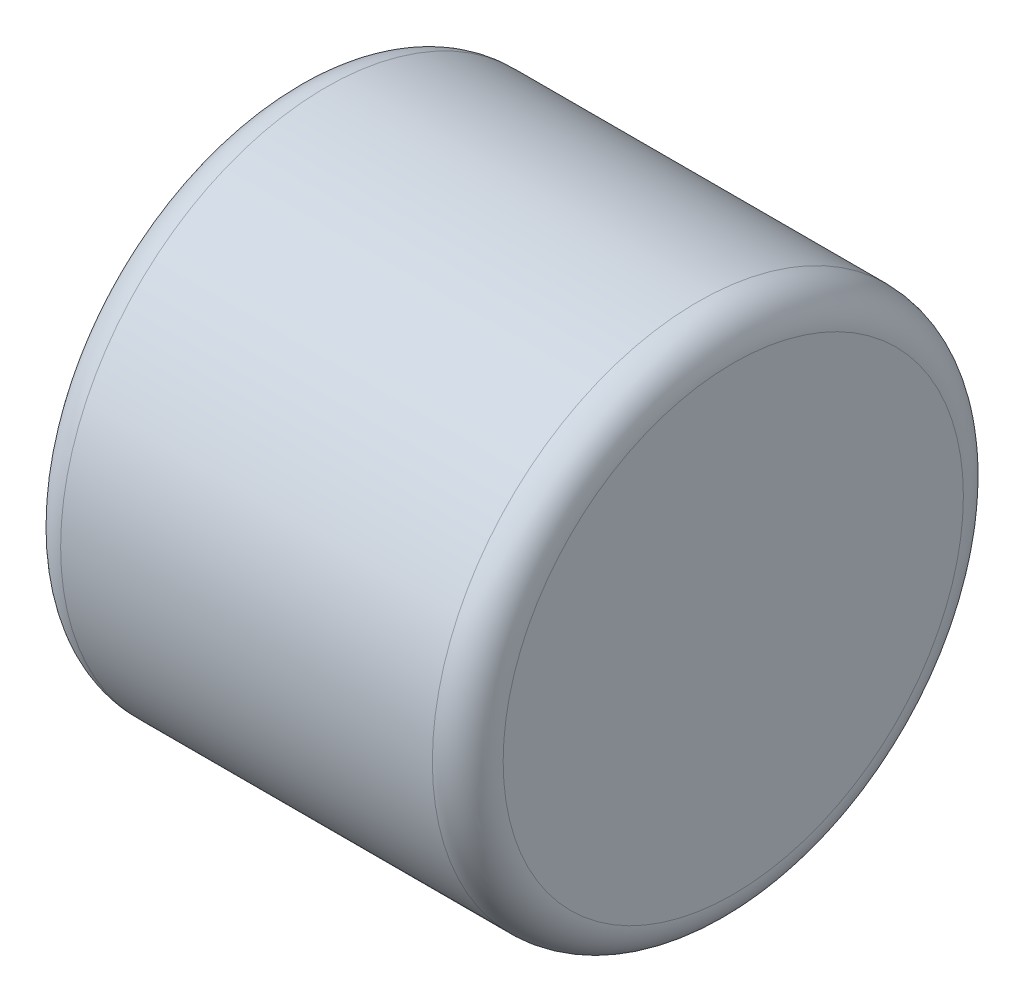
ISO-10303-21;
HEADER;
FILE_DESCRIPTION(('STEP AP214'),'2;1');
FILE_NAME('part.step','',(''),(''),'','','');
FILE_SCHEMA(('AUTOMOTIVE_DESIGN { 1 0 10303 214 1 1 1 1 }'));
ENDSEC;
DATA;
#1=APPLICATION_CONTEXT('core data for automotive mechanical design processes');
#2=APPLICATION_PROTOCOL_DEFINITION('international standard','automotive_design',2000,#1);
#3=PRODUCT_CONTEXT('',#1,'mechanical');
#4=PRODUCT('Part','Part','',(#3));
#5=PRODUCT_RELATED_PRODUCT_CATEGORY('part','',(#4));
#6=PRODUCT_DEFINITION_FORMATION('','',#4);
#7=PRODUCT_DEFINITION_CONTEXT('part definition',#1,'design');
#8=PRODUCT_DEFINITION('design','',#6,#7);
#9=PRODUCT_DEFINITION_SHAPE('','',#8);
#10=(LENGTH_UNIT() NAMED_UNIT(*) SI_UNIT(.MILLI.,.METRE.));
#11=(NAMED_UNIT(*) PLANE_ANGLE_UNIT() SI_UNIT($,.RADIAN.));
#12=(NAMED_UNIT(*) SI_UNIT($,.STERADIAN.) SOLID_ANGLE_UNIT());
#13=UNCERTAINTY_MEASURE_WITH_UNIT(LENGTH_MEASURE(1.E-05),#10,'distance_accuracy_value','');
#14=(GEOMETRIC_REPRESENTATION_CONTEXT(3) GLOBAL_UNCERTAINTY_ASSIGNED_CONTEXT((#13)) GLOBAL_UNIT_ASSIGNED_CONTEXT((#10,
#11,#12)) REPRESENTATION_CONTEXT('',''));
#15=CARTESIAN_POINT('',(0.,0.,0.));
#16=DIRECTION('',(0.,0.,1.));
#17=DIRECTION('',(1.,0.,0.));
#18=AXIS2_PLACEMENT_3D('',#15,#16,#17);
#19=CARTESIAN_POINT('',(2.5,0.,0.));
#20=DIRECTION('',(-1.,0.,0.));
#21=DIRECTION('',(0.,0.,1.));
#22=AXIS2_PLACEMENT_3D('',#19,#20,#21);
#23=PLANE('',#22);
#24=CARTESIAN_POINT('',(2.5,0.,0.));
#25=DIRECTION('',(-1.,0.,0.));
#26=DIRECTION('',(0.,0.,1.));
#27=AXIS2_PLACEMENT_3D('',#24,#25,#26);
#28=CIRCLE('',#27,1.3);
#29=CARTESIAN_POINT('',(2.5,0.,1.3));
#30=VERTEX_POINT('',#29);
#31=CARTESIAN_POINT('',(2.5,0.,-1.3));
#32=VERTEX_POINT('',#31);
#33=EDGE_CURVE('E46',#30,#32,#28,.T.);
#34=ORIENTED_EDGE('',*,*,#33,.F.);
#35=CARTESIAN_POINT('',(2.5,0.,0.));
#36=DIRECTION('',(-1.,0.,0.));
#37=DIRECTION('',(0.,0.,-1.));
#38=AXIS2_PLACEMENT_3D('',#35,#36,#37);
#39=CIRCLE('',#38,1.3);
#40=EDGE_CURVE('E49',#32,#30,#39,.T.);
#41=ORIENTED_EDGE('',*,*,#40,.F.);
#42=EDGE_LOOP('',(#34,#41));
#43=FACE_BOUND('',#42,.T.);
#44=ADVANCED_FACE('F17',(#43),#23,.F.);
#45=CARTESIAN_POINT('',(0.,0.,0.));
#46=DIRECTION('',(1.,0.,0.));
#47=DIRECTION('',(0.,0.,-1.));
#48=AXIS2_PLACEMENT_3D('',#45,#46,#47);
#49=PLANE('',#48);
#50=CARTESIAN_POINT('',(0.,0.,0.));
#51=DIRECTION('',(1.,0.,0.));
#52=DIRECTION('',(0.,0.,-1.));
#53=AXIS2_PLACEMENT_3D('',#50,#51,#52);
#54=CIRCLE('',#53,1.3);
#55=CARTESIAN_POINT('',(0.,0.,-1.3));
#56=VERTEX_POINT('',#55);
#57=CARTESIAN_POINT('',(0.,0.,1.3));
#58=VERTEX_POINT('',#57);
#59=EDGE_CURVE('E56',#56,#58,#54,.T.);
#60=ORIENTED_EDGE('',*,*,#59,.F.);
#61=CARTESIAN_POINT('',(0.,0.,0.));
#62=DIRECTION('',(1.,0.,0.));
#63=DIRECTION('',(0.,0.,1.));
#64=AXIS2_PLACEMENT_3D('',#61,#62,#63);
#65=CIRCLE('',#64,1.3);
#66=EDGE_CURVE('E37',#58,#56,#65,.T.);
#67=ORIENTED_EDGE('',*,*,#66,.F.);
#68=EDGE_LOOP('',(#60,#67));
#69=FACE_BOUND('',#68,.T.);
#70=ADVANCED_FACE('F74',(#69),#49,.F.);
#71=CARTESIAN_POINT('',(2.3,0.,0.));
#72=DIRECTION('',(-1.,0.,0.));
#73=DIRECTION('',(0.,0.,1.));
#74=AXIS2_PLACEMENT_3D('',#71,#72,#73);
#75=TOROIDAL_SURFACE('',#74,1.3,0.2);
#76=CARTESIAN_POINT('',(2.3,0.,0.));
#77=DIRECTION('',(-1.,0.,0.));
#78=DIRECTION('',(0.,0.,1.));
#79=AXIS2_PLACEMENT_3D('',#76,#77,#78);
#80=CIRCLE('',#79,1.5);
#81=CARTESIAN_POINT('',(2.3,0.,1.5));
#82=VERTEX_POINT('',#81);
#83=EDGE_CURVE('E29',#82,#82,#80,.T.);
#84=ORIENTED_EDGE('',*,*,#83,.F.);
#85=EDGE_LOOP('',(#84));
#86=FACE_BOUND('',#85,.T.);
#87=ORIENTED_EDGE('',*,*,#33,.T.);
#88=ORIENTED_EDGE('',*,*,#40,.T.);
#89=EDGE_LOOP('',(#87,#88));
#90=FACE_BOUND('',#89,.T.);
#91=ADVANCED_FACE('F55',(#86,#90),#75,.T.);
#92=CARTESIAN_POINT('',(0.2,0.,0.));
#93=DIRECTION('',(1.,0.,0.));
#94=DIRECTION('',(0.,0.,-1.));
#95=AXIS2_PLACEMENT_3D('',#92,#93,#94);
#96=TOROIDAL_SURFACE('',#95,1.3,0.2);
#97=CARTESIAN_POINT('',(0.2,0.,0.));
#98=DIRECTION('',(-1.,0.,0.));
#99=DIRECTION('',(0.,0.,1.));
#100=AXIS2_PLACEMENT_3D('',#97,#98,#99);
#101=CIRCLE('',#100,1.5);
#102=CARTESIAN_POINT('',(0.2,0.,1.5));
#103=VERTEX_POINT('',#102);
#104=EDGE_CURVE('E11',#103,#103,#101,.F.);
#105=ORIENTED_EDGE('',*,*,#104,.F.);
#106=EDGE_LOOP('',(#105));
#107=FACE_BOUND('',#106,.T.);
#108=ORIENTED_EDGE('',*,*,#59,.T.);
#109=ORIENTED_EDGE('',*,*,#66,.T.);
#110=EDGE_LOOP('',(#108,#109));
#111=FACE_BOUND('',#110,.T.);
#112=ADVANCED_FACE('F73',(#107,#111),#96,.T.);
#113=CARTESIAN_POINT('',(0.,0.,0.));
#114=DIRECTION('',(-1.,0.,0.));
#115=DIRECTION('',(0.,0.,1.));
#116=AXIS2_PLACEMENT_3D('',#113,#114,#115);
#117=CYLINDRICAL_SURFACE('',#116,1.5);
#118=ORIENTED_EDGE('',*,*,#104,.T.);
#119=EDGE_LOOP('',(#118));
#120=FACE_BOUND('',#119,.T.);
#121=ORIENTED_EDGE('',*,*,#83,.T.);
#122=EDGE_LOOP('',(#121));
#123=FACE_BOUND('',#122,.T.);
#124=ADVANCED_FACE('F121',(#120,#123),#117,.T.);
#125=CLOSED_SHELL('',(#44,#70,#91,#112,#124));
#126=MANIFOLD_SOLID_BREP('B1',#125);
#127=ADVANCED_BREP_SHAPE_REPRESENTATION('',(#18,#126),#14);
#128=SHAPE_DEFINITION_REPRESENTATION(#9,#127);
ENDSEC;
END-ISO-10303-21;
